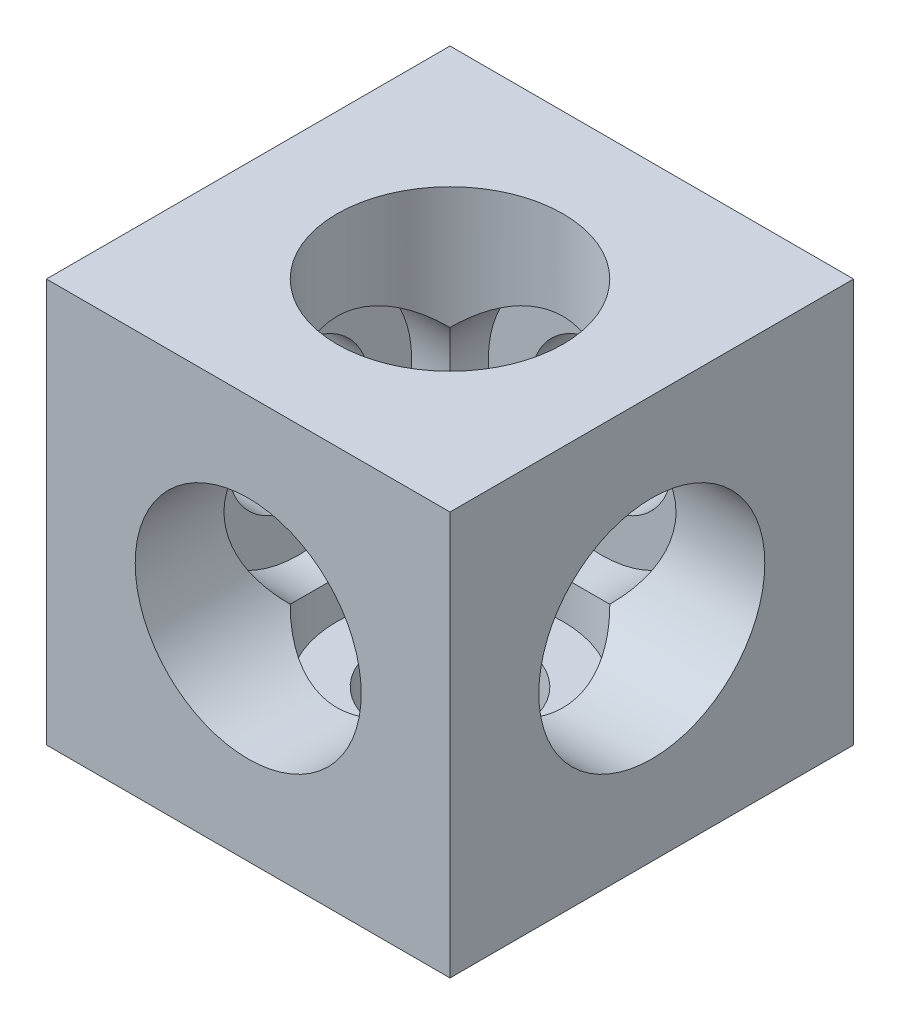
ISO-10303-21;
HEADER;
FILE_DESCRIPTION(('STEP AP214'),'2;1');
FILE_NAME('part.step','',(''),(''),'','','');
FILE_SCHEMA(('AUTOMOTIVE_DESIGN { 1 0 10303 214 1 1 1 1 }'));
ENDSEC;
DATA;
#1=APPLICATION_CONTEXT('core data for automotive mechanical design processes');
#2=APPLICATION_PROTOCOL_DEFINITION('international standard','automotive_design',2000,#1);
#3=PRODUCT_CONTEXT('',#1,'mechanical');
#4=PRODUCT('Part','Part','',(#3));
#5=PRODUCT_RELATED_PRODUCT_CATEGORY('part','',(#4));
#6=PRODUCT_DEFINITION_FORMATION('','',#4);
#7=PRODUCT_DEFINITION_CONTEXT('part definition',#1,'design');
#8=PRODUCT_DEFINITION('design','',#6,#7);
#9=PRODUCT_DEFINITION_SHAPE('','',#8);
#10=(LENGTH_UNIT() NAMED_UNIT(*) SI_UNIT(.MILLI.,.METRE.));
#11=(NAMED_UNIT(*) PLANE_ANGLE_UNIT() SI_UNIT($,.RADIAN.));
#12=(NAMED_UNIT(*) SI_UNIT($,.STERADIAN.) SOLID_ANGLE_UNIT());
#13=UNCERTAINTY_MEASURE_WITH_UNIT(LENGTH_MEASURE(1.E-05),#10,'distance_accuracy_value','');
#14=(GEOMETRIC_REPRESENTATION_CONTEXT(3) GLOBAL_UNCERTAINTY_ASSIGNED_CONTEXT((#13)) GLOBAL_UNIT_ASSIGNED_CONTEXT((#10,
#11,#12)) REPRESENTATION_CONTEXT('',''));
#15=CARTESIAN_POINT('',(0.,0.,0.));
#16=DIRECTION('',(0.,0.,1.));
#17=DIRECTION('',(1.,0.,0.));
#18=AXIS2_PLACEMENT_3D('',#15,#16,#17);
#19=CARTESIAN_POINT('',(0.,-10.,0.));
#20=DIRECTION('',(0.,1.,0.));
#21=DIRECTION('',(-1.,0.,0.));
#22=AXIS2_PLACEMENT_3D('',#19,#20,#21);
#23=CYLINDRICAL_SURFACE('',#22,5.6);
#24=CARTESIAN_POINT('',(0.,10.,0.));
#25=DIRECTION('',(0.,1.,0.));
#26=DIRECTION('',(-1.,0.,0.));
#27=AXIS2_PLACEMENT_3D('',#24,#25,#26);
#28=CIRCLE('',#27,5.6);
#29=CARTESIAN_POINT('',(-5.6,10.,0.));
#30=VERTEX_POINT('',#29);
#31=EDGE_CURVE('E158',#30,#30,#28,.T.);
#32=ORIENTED_EDGE('',*,*,#31,.T.);
#33=EDGE_LOOP('',(#32));
#34=FACE_BOUND('',#33,.T.);
#35=CARTESIAN_POINT('',(0.,0.,0.));
#36=DIRECTION('',(0.,0.707106781186547,-0.707106781186547));
#37=DIRECTION('',(0.,0.707106781186547,0.707106781186547));
#38=AXIS2_PLACEMENT_3D('',#35,#36,#37);
#39=ELLIPSE('',#38,7.91959594928934,5.6);
#40=CARTESIAN_POINT('',(3.95979797464467,3.95979797464467,3.95979797464467));
#41=VERTEX_POINT('',#40);
#42=CARTESIAN_POINT('',(-3.95979797464467,3.95979797464467,3.95979797464467));
#43=VERTEX_POINT('',#42);
#44=EDGE_CURVE('E110',#41,#43,#39,.F.);
#45=ORIENTED_EDGE('',*,*,#44,.T.);
#46=CARTESIAN_POINT('',(0.,0.,0.));
#47=DIRECTION('',(0.707106781186547,0.707106781186548,0.));
#48=DIRECTION('',(-0.707106781186547,0.707106781186547,0.));
#49=AXIS2_PLACEMENT_3D('',#46,#47,#48);
#50=ELLIPSE('',#49,7.91959594928934,5.6);
#51=CARTESIAN_POINT('',(-3.95979797464467,3.95979797464467,-3.95979797464467));
#52=VERTEX_POINT('',#51);
#53=EDGE_CURVE('E98',#43,#52,#50,.F.);
#54=ORIENTED_EDGE('',*,*,#53,.T.);
#55=CARTESIAN_POINT('',(0.,0.,0.));
#56=DIRECTION('',(0.,0.707106781186547,0.707106781186547));
#57=DIRECTION('',(0.,0.707106781186547,-0.707106781186547));
#58=AXIS2_PLACEMENT_3D('',#55,#56,#57);
#59=ELLIPSE('',#58,7.91959594928934,5.6);
#60=CARTESIAN_POINT('',(3.95979797464467,3.95979797464467,-3.95979797464467));
#61=VERTEX_POINT('',#60);
#62=EDGE_CURVE('E104',#52,#61,#59,.F.);
#63=ORIENTED_EDGE('',*,*,#62,.T.);
#64=CARTESIAN_POINT('',(0.,0.,0.));
#65=DIRECTION('',(-0.707106781186547,0.707106781186547,0.));
#66=DIRECTION('',(0.707106781186547,0.707106781186548,0.));
#67=AXIS2_PLACEMENT_3D('',#64,#65,#66);
#68=ELLIPSE('',#67,7.91959594928934,5.6);
#69=EDGE_CURVE('E179',#61,#41,#68,.F.);
#70=ORIENTED_EDGE('',*,*,#69,.T.);
#71=EDGE_LOOP('',(#45,#54,#63,#70));
#72=FACE_BOUND('',#71,.T.);
#73=ADVANCED_FACE('F34',(#34,#72),#23,.F.);
#74=CARTESIAN_POINT('',(10.,-10.,-10.));
#75=DIRECTION('',(0.,0.,-1.));
#76=DIRECTION('',(-1.,0.,0.));
#77=AXIS2_PLACEMENT_3D('',#74,#75,#76);
#78=PLANE('',#77);
#79=CARTESIAN_POINT('',(0.,0.,-10.));
#80=DIRECTION('',(0.,0.,1.));
#81=DIRECTION('',(1.,0.,0.));
#82=AXIS2_PLACEMENT_3D('',#79,#80,#81);
#83=CIRCLE('',#82,3.50000000000001);
#84=CARTESIAN_POINT('',(3.50000000000001,0.,-10.));
#85=VERTEX_POINT('',#84);
#86=EDGE_CURVE('E167',#85,#85,#83,.T.);
#87=ORIENTED_EDGE('',*,*,#86,.T.);
#88=EDGE_LOOP('',(#87));
#89=FACE_BOUND('',#88,.T.);
#90=DIRECTION('',(-1.,0.,0.));
#91=VECTOR('',#90,1.);
#92=CARTESIAN_POINT('',(10.,10.,-10.));
#93=LINE('',#92,#91);
#94=CARTESIAN_POINT('',(10.,10.,-10.));
#95=VERTEX_POINT('',#94);
#96=CARTESIAN_POINT('',(-10.,10.,-10.));
#97=VERTEX_POINT('',#96);
#98=EDGE_CURVE('E142',#95,#97,#93,.T.);
#99=ORIENTED_EDGE('',*,*,#98,.F.);
#100=DIRECTION('',(0.,1.,0.));
#101=VECTOR('',#100,1.);
#102=CARTESIAN_POINT('',(10.,-10.,-10.));
#103=LINE('',#102,#101);
#104=CARTESIAN_POINT('',(10.,-10.,-10.));
#105=VERTEX_POINT('',#104);
#106=EDGE_CURVE('E123',#105,#95,#103,.T.);
#107=ORIENTED_EDGE('',*,*,#106,.F.);
#108=DIRECTION('',(-1.,0.,0.));
#109=VECTOR('',#108,1.);
#110=CARTESIAN_POINT('',(10.,-10.,-10.));
#111=LINE('',#110,#109);
#112=CARTESIAN_POINT('',(-10.,-10.,-10.));
#113=VERTEX_POINT('',#112);
#114=EDGE_CURVE('E135',#105,#113,#111,.T.);
#115=ORIENTED_EDGE('',*,*,#114,.T.);
#116=DIRECTION('',(0.,1.,0.));
#117=VECTOR('',#116,1.);
#118=CARTESIAN_POINT('',(-10.,-10.,-10.));
#119=LINE('',#118,#117);
#120=EDGE_CURVE('E124',#113,#97,#119,.T.);
#121=ORIENTED_EDGE('',*,*,#120,.T.);
#122=EDGE_LOOP('',(#99,#107,#115,#121));
#123=FACE_BOUND('',#122,.T.);
#124=ADVANCED_FACE('F36',(#89,#123),#78,.T.);
#125=CARTESIAN_POINT('',(10.,-10.,10.));
#126=DIRECTION('',(1.,0.,0.));
#127=DIRECTION('',(0.,0.,-1.));
#128=AXIS2_PLACEMENT_3D('',#125,#126,#127);
#129=PLANE('',#128);
#130=CARTESIAN_POINT('',(10.,0.,0.));
#131=DIRECTION('',(1.,0.,0.));
#132=DIRECTION('',(0.,0.,-1.));
#133=AXIS2_PLACEMENT_3D('',#130,#131,#132);
#134=CIRCLE('',#133,5.60000000000001);
#135=CARTESIAN_POINT('',(10.,0.,-5.60000000000001));
#136=VERTEX_POINT('',#135);
#137=EDGE_CURVE('E194',#136,#136,#134,.T.);
#138=ORIENTED_EDGE('',*,*,#137,.F.);
#139=EDGE_LOOP('',(#138));
#140=FACE_BOUND('',#139,.T.);
#141=DIRECTION('',(0.,0.,-1.));
#142=VECTOR('',#141,1.);
#143=CARTESIAN_POINT('',(10.,10.,10.));
#144=LINE('',#143,#142);
#145=CARTESIAN_POINT('',(10.,10.,10.));
#146=VERTEX_POINT('',#145);
#147=EDGE_CURVE('E132',#146,#95,#144,.T.);
#148=ORIENTED_EDGE('',*,*,#147,.F.);
#149=DIRECTION('',(0.,1.,0.));
#150=VECTOR('',#149,1.);
#151=CARTESIAN_POINT('',(10.,-10.,10.));
#152=LINE('',#151,#150);
#153=CARTESIAN_POINT('',(10.,-10.,10.));
#154=VERTEX_POINT('',#153);
#155=EDGE_CURVE('E129',#154,#146,#152,.T.);
#156=ORIENTED_EDGE('',*,*,#155,.F.);
#157=DIRECTION('',(0.,0.,-1.));
#158=VECTOR('',#157,1.);
#159=CARTESIAN_POINT('',(10.,-10.,10.));
#160=LINE('',#159,#158);
#161=EDGE_CURVE('E127',#154,#105,#160,.T.);
#162=ORIENTED_EDGE('',*,*,#161,.T.);
#163=ORIENTED_EDGE('',*,*,#106,.T.);
#164=EDGE_LOOP('',(#148,#156,#162,#163));
#165=FACE_BOUND('',#164,.T.);
#166=ADVANCED_FACE('F200',(#140,#165),#129,.T.);
#167=CARTESIAN_POINT('',(-10.,-10.,10.));
#168=DIRECTION('',(0.,0.,1.));
#169=DIRECTION('',(1.,0.,0.));
#170=AXIS2_PLACEMENT_3D('',#167,#168,#169);
#171=PLANE('',#170);
#172=CARTESIAN_POINT('',(0.,0.,10.));
#173=DIRECTION('',(0.,0.,1.));
#174=DIRECTION('',(1.,0.,0.));
#175=AXIS2_PLACEMENT_3D('',#172,#173,#174);
#176=CIRCLE('',#175,5.60000000000001);
#177=CARTESIAN_POINT('',(5.60000000000001,0.,10.));
#178=VERTEX_POINT('',#177);
#179=EDGE_CURVE('E176',#178,#178,#176,.T.);
#180=ORIENTED_EDGE('',*,*,#179,.F.);
#181=EDGE_LOOP('',(#180));
#182=FACE_BOUND('',#181,.T.);
#183=DIRECTION('',(1.,0.,0.));
#184=VECTOR('',#183,1.);
#185=CARTESIAN_POINT('',(-10.,10.,10.));
#186=LINE('',#185,#184);
#187=CARTESIAN_POINT('',(-10.,10.,10.));
#188=VERTEX_POINT('',#187);
#189=EDGE_CURVE('E136',#188,#146,#186,.T.);
#190=ORIENTED_EDGE('',*,*,#189,.F.);
#191=DIRECTION('',(0.,1.,0.));
#192=VECTOR('',#191,1.);
#193=CARTESIAN_POINT('',(-10.,-10.,10.));
#194=LINE('',#193,#192);
#195=CARTESIAN_POINT('',(-10.,-10.,10.));
#196=VERTEX_POINT('',#195);
#197=EDGE_CURVE('E126',#196,#188,#194,.T.);
#198=ORIENTED_EDGE('',*,*,#197,.F.);
#199=DIRECTION('',(1.,0.,0.));
#200=VECTOR('',#199,1.);
#201=CARTESIAN_POINT('',(-10.,-10.,10.));
#202=LINE('',#201,#200);
#203=EDGE_CURVE('E148',#196,#154,#202,.T.);
#204=ORIENTED_EDGE('',*,*,#203,.T.);
#205=ORIENTED_EDGE('',*,*,#155,.T.);
#206=EDGE_LOOP('',(#190,#198,#204,#205));
#207=FACE_BOUND('',#206,.T.);
#208=ADVANCED_FACE('F203',(#182,#207),#171,.T.);
#209=CARTESIAN_POINT('',(-10.,-10.,-10.));
#210=DIRECTION('',(-1.,0.,0.));
#211=DIRECTION('',(0.,0.,1.));
#212=AXIS2_PLACEMENT_3D('',#209,#210,#211);
#213=PLANE('',#212);
#214=CARTESIAN_POINT('',(-10.,0.,0.));
#215=DIRECTION('',(1.,0.,0.));
#216=DIRECTION('',(0.,0.,-1.));
#217=AXIS2_PLACEMENT_3D('',#214,#215,#216);
#218=CIRCLE('',#217,3.50000000000001);
#219=CARTESIAN_POINT('',(-10.,0.,-3.50000000000001));
#220=VERTEX_POINT('',#219);
#221=EDGE_CURVE('E185',#220,#220,#218,.T.);
#222=ORIENTED_EDGE('',*,*,#221,.T.);
#223=EDGE_LOOP('',(#222));
#224=FACE_BOUND('',#223,.T.);
#225=DIRECTION('',(0.,0.,1.));
#226=VECTOR('',#225,1.);
#227=CARTESIAN_POINT('',(-10.,10.,-10.));
#228=LINE('',#227,#226);
#229=EDGE_CURVE('E139',#97,#188,#228,.T.);
#230=ORIENTED_EDGE('',*,*,#229,.F.);
#231=ORIENTED_EDGE('',*,*,#120,.F.);
#232=DIRECTION('',(0.,0.,1.));
#233=VECTOR('',#232,1.);
#234=CARTESIAN_POINT('',(-10.,-10.,-10.));
#235=LINE('',#234,#233);
#236=EDGE_CURVE('E151',#113,#196,#235,.T.);
#237=ORIENTED_EDGE('',*,*,#236,.T.);
#238=ORIENTED_EDGE('',*,*,#197,.T.);
#239=EDGE_LOOP('',(#230,#231,#237,#238));
#240=FACE_BOUND('',#239,.T.);
#241=ADVANCED_FACE('F220',(#224,#240),#213,.T.);
#242=CARTESIAN_POINT('',(0.,-10.,0.));
#243=DIRECTION('',(0.,1.,0.));
#244=DIRECTION('',(0.,0.,1.));
#245=AXIS2_PLACEMENT_3D('',#242,#243,#244);
#246=PLANE('',#245);
#247=CARTESIAN_POINT('',(0.,-10.,0.));
#248=DIRECTION('',(0.,1.,0.));
#249=DIRECTION('',(-1.,0.,0.));
#250=AXIS2_PLACEMENT_3D('',#247,#248,#249);
#251=CIRCLE('',#250,3.5);
#252=CARTESIAN_POINT('',(-3.5,-10.,0.));
#253=VERTEX_POINT('',#252);
#254=EDGE_CURVE('E145',#253,#253,#251,.T.);
#255=ORIENTED_EDGE('',*,*,#254,.T.);
#256=EDGE_LOOP('',(#255));
#257=FACE_BOUND('',#256,.T.);
#258=ORIENTED_EDGE('',*,*,#114,.F.);
#259=ORIENTED_EDGE('',*,*,#161,.F.);
#260=ORIENTED_EDGE('',*,*,#203,.F.);
#261=ORIENTED_EDGE('',*,*,#236,.F.);
#262=EDGE_LOOP('',(#258,#259,#260,#261));
#263=FACE_BOUND('',#262,.T.);
#264=ADVANCED_FACE('F217',(#257,#263),#246,.F.);
#265=CARTESIAN_POINT('',(0.,10.,0.));
#266=DIRECTION('',(0.,1.,0.));
#267=DIRECTION('',(0.,0.,1.));
#268=AXIS2_PLACEMENT_3D('',#265,#266,#267);
#269=PLANE('',#268);
#270=ORIENTED_EDGE('',*,*,#31,.F.);
#271=EDGE_LOOP('',(#270));
#272=FACE_BOUND('',#271,.T.);
#273=ORIENTED_EDGE('',*,*,#98,.T.);
#274=ORIENTED_EDGE('',*,*,#229,.T.);
#275=ORIENTED_EDGE('',*,*,#189,.T.);
#276=ORIENTED_EDGE('',*,*,#147,.T.);
#277=EDGE_LOOP('',(#273,#274,#275,#276));
#278=FACE_BOUND('',#277,.T.);
#279=ADVANCED_FACE('F208',(#272,#278),#269,.T.);
#280=CARTESIAN_POINT('',(0.,-10.,0.));
#281=DIRECTION('',(0.,1.,0.));
#282=DIRECTION('',(-1.,0.,0.));
#283=AXIS2_PLACEMENT_3D('',#280,#281,#282);
#284=CYLINDRICAL_SURFACE('',#283,3.5);
#285=ORIENTED_EDGE('',*,*,#254,.F.);
#286=EDGE_LOOP('',(#285));
#287=FACE_BOUND('',#286,.T.);
#288=CARTESIAN_POINT('',(0.,-7.5,0.));
#289=DIRECTION('',(0.,1.,0.));
#290=DIRECTION('',(-1.,0.,0.));
#291=AXIS2_PLACEMENT_3D('',#288,#289,#290);
#292=CIRCLE('',#291,3.5);
#293=CARTESIAN_POINT('',(-3.5,-7.5,0.));
#294=VERTEX_POINT('',#293);
#295=EDGE_CURVE('E164',#294,#294,#292,.T.);
#296=ORIENTED_EDGE('',*,*,#295,.T.);
#297=EDGE_LOOP('',(#296));
#298=FACE_BOUND('',#297,.T.);
#299=ADVANCED_FACE('F243',(#287,#298),#284,.F.);
#300=CARTESIAN_POINT('',(0.,0.,0.));
#301=DIRECTION('',(0.,0.707106781186547,0.707106781186547));
#302=DIRECTION('',(0.,0.707106781186547,-0.707106781186547));
#303=AXIS2_PLACEMENT_3D('',#300,#301,#302);
#304=ELLIPSE('',#303,7.91959594928934,5.6);
#305=CARTESIAN_POINT('',(-3.95979797464467,-3.95979797464467,3.95979797464467));
#306=VERTEX_POINT('',#305);
#307=CARTESIAN_POINT('',(3.95979797464467,-3.95979797464467,3.95979797464467));
#308=VERTEX_POINT('',#307);
#309=EDGE_CURVE('E115',#306,#308,#304,.T.);
#310=ORIENTED_EDGE('',*,*,#309,.T.);
#311=CARTESIAN_POINT('',(0.,0.,0.));
#312=DIRECTION('',(0.707106781186547,0.707106781186548,0.));
#313=DIRECTION('',(-0.707106781186547,0.707106781186547,0.));
#314=AXIS2_PLACEMENT_3D('',#311,#312,#313);
#315=ELLIPSE('',#314,7.91959594928934,5.6);
#316=CARTESIAN_POINT('',(3.95979797464467,-3.95979797464467,-3.95979797464467));
#317=VERTEX_POINT('',#316);
#318=EDGE_CURVE('E49',#308,#317,#315,.T.);
#319=ORIENTED_EDGE('',*,*,#318,.T.);
#320=CARTESIAN_POINT('',(0.,0.,0.));
#321=DIRECTION('',(0.,0.707106781186547,-0.707106781186547));
#322=DIRECTION('',(0.,0.707106781186547,0.707106781186547));
#323=AXIS2_PLACEMENT_3D('',#320,#321,#322);
#324=ELLIPSE('',#323,7.91959594928934,5.6);
#325=CARTESIAN_POINT('',(-3.95979797464467,-3.95979797464467,-3.95979797464467));
#326=VERTEX_POINT('',#325);
#327=EDGE_CURVE('E118',#317,#326,#324,.T.);
#328=ORIENTED_EDGE('',*,*,#327,.T.);
#329=CARTESIAN_POINT('',(0.,0.,0.));
#330=DIRECTION('',(-0.707106781186547,0.707106781186547,0.));
#331=DIRECTION('',(0.707106781186547,0.707106781186548,0.));
#332=AXIS2_PLACEMENT_3D('',#329,#330,#331);
#333=ELLIPSE('',#332,7.91959594928934,5.6);
#334=EDGE_CURVE('E57',#326,#306,#333,.T.);
#335=ORIENTED_EDGE('',*,*,#334,.T.);
#336=EDGE_LOOP('',(#310,#319,#328,#335));
#337=FACE_BOUND('',#336,.T.);
#338=CARTESIAN_POINT('',(0.,-7.5,0.));
#339=DIRECTION('',(0.,1.,0.));
#340=DIRECTION('',(-1.,0.,0.));
#341=AXIS2_PLACEMENT_3D('',#338,#339,#340);
#342=CIRCLE('',#341,5.6);
#343=CARTESIAN_POINT('',(-5.6,-7.5,0.));
#344=VERTEX_POINT('',#343);
#345=EDGE_CURVE('E161',#344,#344,#342,.T.);
#346=ORIENTED_EDGE('',*,*,#345,.F.);
#347=EDGE_LOOP('',(#346));
#348=FACE_BOUND('',#347,.T.);
#349=ADVANCED_FACE('F234',(#337,#348),#23,.F.);
#350=CARTESIAN_POINT('',(5.6,-7.5,0.));
#351=DIRECTION('',(0.,-1.,0.));
#352=DIRECTION('',(1.,0.,0.));
#353=AXIS2_PLACEMENT_3D('',#350,#351,#352);
#354=PLANE('',#353);
#355=ORIENTED_EDGE('',*,*,#295,.F.);
#356=EDGE_LOOP('',(#355));
#357=FACE_BOUND('',#356,.T.);
#358=ORIENTED_EDGE('',*,*,#345,.T.);
#359=EDGE_LOOP('',(#358));
#360=FACE_BOUND('',#359,.T.);
#361=ADVANCED_FACE('F242',(#357,#360),#354,.F.);
#362=CARTESIAN_POINT('',(0.,0.,10.));
#363=DIRECTION('',(0.,0.,1.));
#364=DIRECTION('',(1.,0.,0.));
#365=AXIS2_PLACEMENT_3D('',#362,#363,#364);
#366=CYLINDRICAL_SURFACE('',#365,5.60000000000001);
#367=ORIENTED_EDGE('',*,*,#179,.T.);
#368=EDGE_LOOP('',(#367));
#369=FACE_BOUND('',#368,.T.);
#370=ORIENTED_EDGE('',*,*,#309,.F.);
#371=CARTESIAN_POINT('',(0.,0.,0.));
#372=DIRECTION('',(0.707106781186547,0.,0.707106781186547));
#373=DIRECTION('',(-0.707106781186547,0.,0.707106781186547));
#374=AXIS2_PLACEMENT_3D('',#371,#372,#373);
#375=ELLIPSE('',#374,7.91959594928934,5.60000000000001);
#376=EDGE_CURVE('E112',#306,#43,#375,.F.);
#377=ORIENTED_EDGE('',*,*,#376,.T.);
#378=ORIENTED_EDGE('',*,*,#44,.F.);
#379=CARTESIAN_POINT('',(0.,0.,0.));
#380=DIRECTION('',(-0.707106781186547,0.,0.707106781186547));
#381=DIRECTION('',(0.707106781186547,0.,0.707106781186547));
#382=AXIS2_PLACEMENT_3D('',#379,#380,#381);
#383=ELLIPSE('',#382,7.91959594928934,5.60000000000001);
#384=EDGE_CURVE('E111',#41,#308,#383,.F.);
#385=ORIENTED_EDGE('',*,*,#384,.T.);
#386=EDGE_LOOP('',(#370,#377,#378,#385));
#387=FACE_BOUND('',#386,.T.);
#388=ADVANCED_FACE('F249',(#369,#387),#366,.F.);
#389=CARTESIAN_POINT('',(0.,0.,-7.5));
#390=DIRECTION('',(0.,0.,1.));
#391=DIRECTION('',(1.,0.,0.));
#392=AXIS2_PLACEMENT_3D('',#389,#390,#391);
#393=CIRCLE('',#392,5.60000000000001);
#394=CARTESIAN_POINT('',(5.60000000000001,0.,-7.5));
#395=VERTEX_POINT('',#394);
#396=EDGE_CURVE('E173',#395,#395,#393,.T.);
#397=ORIENTED_EDGE('',*,*,#396,.F.);
#398=EDGE_LOOP('',(#397));
#399=FACE_BOUND('',#398,.T.);
#400=ORIENTED_EDGE('',*,*,#327,.F.);
#401=CARTESIAN_POINT('',(0.,0.,0.));
#402=DIRECTION('',(0.707106781186547,0.,0.707106781186547));
#403=DIRECTION('',(-0.707106781186547,0.,0.707106781186547));
#404=AXIS2_PLACEMENT_3D('',#401,#402,#403);
#405=ELLIPSE('',#404,7.91959594928934,5.60000000000001);
#406=EDGE_CURVE('E11',#317,#61,#405,.T.);
#407=ORIENTED_EDGE('',*,*,#406,.T.);
#408=ORIENTED_EDGE('',*,*,#62,.F.);
#409=CARTESIAN_POINT('',(0.,0.,0.));
#410=DIRECTION('',(-0.707106781186547,0.,0.707106781186547));
#411=DIRECTION('',(0.707106781186547,0.,0.707106781186547));
#412=AXIS2_PLACEMENT_3D('',#409,#410,#411);
#413=ELLIPSE('',#412,7.91959594928934,5.60000000000001);
#414=EDGE_CURVE('E42',#52,#326,#413,.T.);
#415=ORIENTED_EDGE('',*,*,#414,.T.);
#416=EDGE_LOOP('',(#400,#407,#408,#415));
#417=FACE_BOUND('',#416,.T.);
#418=ADVANCED_FACE('F114',(#399,#417),#366,.F.);
#419=CARTESIAN_POINT('',(0.,0.,10.));
#420=DIRECTION('',(0.,0.,1.));
#421=DIRECTION('',(1.,0.,0.));
#422=AXIS2_PLACEMENT_3D('',#419,#420,#421);
#423=CYLINDRICAL_SURFACE('',#422,3.50000000000001);
#424=ORIENTED_EDGE('',*,*,#86,.F.);
#425=EDGE_LOOP('',(#424));
#426=FACE_BOUND('',#425,.T.);
#427=CARTESIAN_POINT('',(0.,0.,-7.5));
#428=DIRECTION('',(0.,0.,1.));
#429=DIRECTION('',(1.,0.,0.));
#430=AXIS2_PLACEMENT_3D('',#427,#428,#429);
#431=CIRCLE('',#430,3.50000000000001);
#432=CARTESIAN_POINT('',(3.50000000000001,0.,-7.5));
#433=VERTEX_POINT('',#432);
#434=EDGE_CURVE('E170',#433,#433,#431,.T.);
#435=ORIENTED_EDGE('',*,*,#434,.T.);
#436=EDGE_LOOP('',(#435));
#437=FACE_BOUND('',#436,.T.);
#438=ADVANCED_FACE('F275',(#426,#437),#423,.F.);
#439=CARTESIAN_POINT('',(3.50000000000001,0.,-7.5));
#440=DIRECTION('',(0.,0.,-1.));
#441=DIRECTION('',(-1.,0.,0.));
#442=AXIS2_PLACEMENT_3D('',#439,#440,#441);
#443=PLANE('',#442);
#444=ORIENTED_EDGE('',*,*,#434,.F.);
#445=EDGE_LOOP('',(#444));
#446=FACE_BOUND('',#445,.T.);
#447=ORIENTED_EDGE('',*,*,#396,.T.);
#448=EDGE_LOOP('',(#447));
#449=FACE_BOUND('',#448,.T.);
#450=ADVANCED_FACE('F268',(#446,#449),#443,.F.);
#451=CARTESIAN_POINT('',(-7.5,3.50000000000001,0.));
#452=DIRECTION('',(-1.,0.,0.));
#453=DIRECTION('',(0.,0.,1.));
#454=AXIS2_PLACEMENT_3D('',#451,#452,#453);
#455=PLANE('',#454);
#456=CARTESIAN_POINT('',(-7.5,0.,0.));
#457=DIRECTION('',(1.,0.,0.));
#458=DIRECTION('',(0.,0.,-1.));
#459=AXIS2_PLACEMENT_3D('',#456,#457,#458);
#460=CIRCLE('',#459,3.50000000000001);
#461=CARTESIAN_POINT('',(-7.5,0.,-3.50000000000001));
#462=VERTEX_POINT('',#461);
#463=EDGE_CURVE('E188',#462,#462,#460,.T.);
#464=ORIENTED_EDGE('',*,*,#463,.F.);
#465=EDGE_LOOP('',(#464));
#466=FACE_BOUND('',#465,.T.);
#467=CARTESIAN_POINT('',(-7.5,0.,0.));
#468=DIRECTION('',(1.,0.,0.));
#469=DIRECTION('',(0.,0.,-1.));
#470=AXIS2_PLACEMENT_3D('',#467,#468,#469);
#471=CIRCLE('',#470,5.60000000000001);
#472=CARTESIAN_POINT('',(-7.5,0.,-5.60000000000001));
#473=VERTEX_POINT('',#472);
#474=EDGE_CURVE('E191',#473,#473,#471,.T.);
#475=ORIENTED_EDGE('',*,*,#474,.T.);
#476=EDGE_LOOP('',(#475));
#477=FACE_BOUND('',#476,.T.);
#478=ADVANCED_FACE('F265',(#466,#477),#455,.F.);
#479=CARTESIAN_POINT('',(10.,0.,0.));
#480=DIRECTION('',(1.,0.,0.));
#481=DIRECTION('',(0.,0.,-1.));
#482=AXIS2_PLACEMENT_3D('',#479,#480,#481);
#483=CYLINDRICAL_SURFACE('',#482,3.50000000000001);
#484=ORIENTED_EDGE('',*,*,#221,.F.);
#485=EDGE_LOOP('',(#484));
#486=FACE_BOUND('',#485,.T.);
#487=ORIENTED_EDGE('',*,*,#463,.T.);
#488=EDGE_LOOP('',(#487));
#489=FACE_BOUND('',#488,.T.);
#490=ADVANCED_FACE('F262',(#486,#489),#483,.F.);
#491=CARTESIAN_POINT('',(10.,0.,0.));
#492=DIRECTION('',(1.,0.,0.));
#493=DIRECTION('',(0.,0.,-1.));
#494=AXIS2_PLACEMENT_3D('',#491,#492,#493);
#495=CYLINDRICAL_SURFACE('',#494,5.60000000000001);
#496=ORIENTED_EDGE('',*,*,#474,.F.);
#497=EDGE_LOOP('',(#496));
#498=FACE_BOUND('',#497,.T.);
#499=ORIENTED_EDGE('',*,*,#376,.F.);
#500=ORIENTED_EDGE('',*,*,#334,.F.);
#501=ORIENTED_EDGE('',*,*,#414,.F.);
#502=ORIENTED_EDGE('',*,*,#53,.F.);
#503=EDGE_LOOP('',(#499,#500,#501,#502));
#504=FACE_BOUND('',#503,.T.);
#505=ADVANCED_FACE('F97',(#498,#504),#495,.F.);
#506=ORIENTED_EDGE('',*,*,#137,.T.);
#507=EDGE_LOOP('',(#506));
#508=FACE_BOUND('',#507,.T.);
#509=ORIENTED_EDGE('',*,*,#318,.F.);
#510=ORIENTED_EDGE('',*,*,#384,.F.);
#511=ORIENTED_EDGE('',*,*,#69,.F.);
#512=ORIENTED_EDGE('',*,*,#406,.F.);
#513=EDGE_LOOP('',(#509,#510,#511,#512));
#514=FACE_BOUND('',#513,.T.);
#515=ADVANCED_FACE('F198',(#508,#514),#495,.F.);
#516=CLOSED_SHELL('',(#73,#124,#166,#208,#241,#264,#279,#299,#349,#361,#388,#418,#438,#450,#478,
#490,#505,#515));
#517=MANIFOLD_SOLID_BREP('B2',#516);
#518=ADVANCED_BREP_SHAPE_REPRESENTATION('',(#18,#517),#14);
#519=SHAPE_DEFINITION_REPRESENTATION(#9,#518);
ENDSEC;
END-ISO-10303-21;
